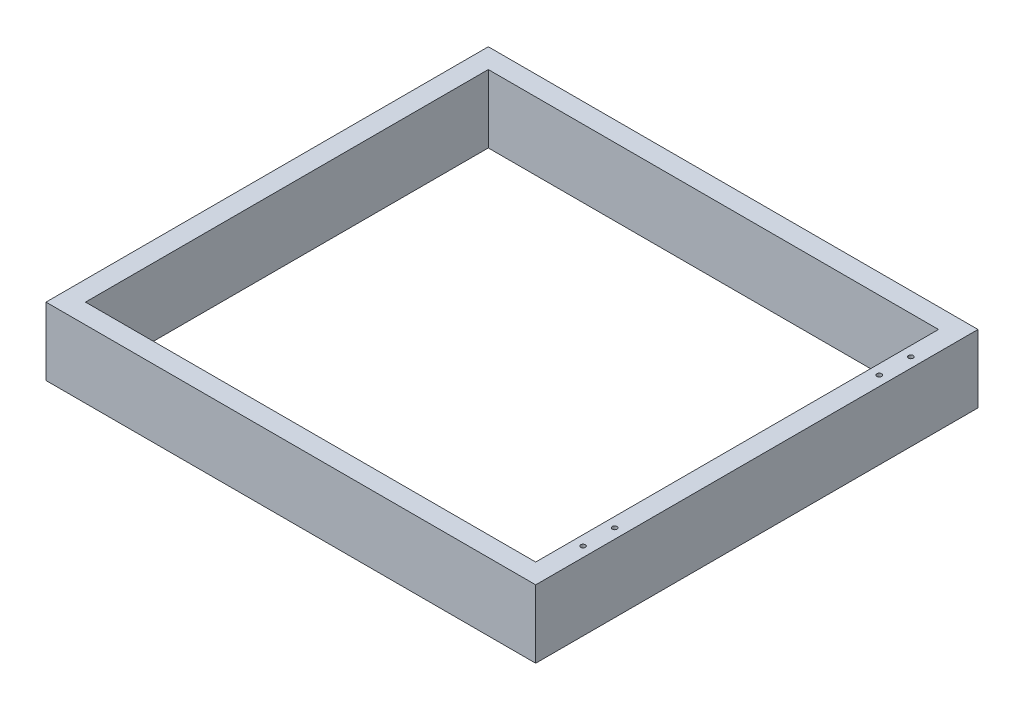
ISO-10303-21;
HEADER;
FILE_DESCRIPTION(('STEP AP214'),'2;1');
FILE_NAME('part.step','',(''),(''),'','','');
FILE_SCHEMA(('AUTOMOTIVE_DESIGN { 1 0 10303 214 1 1 1 1 }'));
ENDSEC;
DATA;
#1=APPLICATION_CONTEXT('core data for automotive mechanical design processes');
#2=APPLICATION_PROTOCOL_DEFINITION('international standard','automotive_design',2000,#1);
#3=PRODUCT_CONTEXT('',#1,'mechanical');
#4=PRODUCT('Part','Part','',(#3));
#5=PRODUCT_RELATED_PRODUCT_CATEGORY('part','',(#4));
#6=PRODUCT_DEFINITION_FORMATION('','',#4);
#7=PRODUCT_DEFINITION_CONTEXT('part definition',#1,'design');
#8=PRODUCT_DEFINITION('design','',#6,#7);
#9=PRODUCT_DEFINITION_SHAPE('','',#8);
#10=(LENGTH_UNIT() NAMED_UNIT(*) SI_UNIT(.MILLI.,.METRE.));
#11=(NAMED_UNIT(*) PLANE_ANGLE_UNIT() SI_UNIT($,.RADIAN.));
#12=(NAMED_UNIT(*) SI_UNIT($,.STERADIAN.) SOLID_ANGLE_UNIT());
#13=UNCERTAINTY_MEASURE_WITH_UNIT(LENGTH_MEASURE(1.E-05),#10,'distance_accuracy_value','');
#14=(GEOMETRIC_REPRESENTATION_CONTEXT(3) GLOBAL_UNCERTAINTY_ASSIGNED_CONTEXT((#13)) GLOBAL_UNIT_ASSIGNED_CONTEXT((#10,
#11,#12)) REPRESENTATION_CONTEXT('',''));
#15=CARTESIAN_POINT('',(0.,0.,0.));
#16=DIRECTION('',(0.,0.,1.));
#17=DIRECTION('',(1.,0.,0.));
#18=AXIS2_PLACEMENT_3D('',#15,#16,#17);
#19=CARTESIAN_POINT('',(0.,43.,0.));
#20=DIRECTION('',(0.,-1.,0.));
#21=DIRECTION('',(0.,0.,-1.));
#22=AXIS2_PLACEMENT_3D('',#19,#20,#21);
#23=PLANE('',#22);
#24=CARTESIAN_POINT('',(303.75,43.,-243.75));
#25=DIRECTION('',(0.,1.,0.));
#26=DIRECTION('',(0.,0.,1.));
#27=AXIS2_PLACEMENT_3D('',#24,#25,#26);
#28=CIRCLE('',#27,1.50000000000002);
#29=CARTESIAN_POINT('',(303.75,43.,-242.25));
#30=VERTEX_POINT('',#29);
#31=EDGE_CURVE('E256',#30,#30,#28,.T.);
#32=ORIENTED_EDGE('',*,*,#31,.F.);
#33=EDGE_LOOP('',(#32));
#34=FACE_BOUND('',#33,.T.);
#35=CARTESIAN_POINT('',(303.75,43.,-223.75));
#36=DIRECTION('',(0.,1.,0.));
#37=DIRECTION('',(0.,0.,1.));
#38=AXIS2_PLACEMENT_3D('',#35,#36,#37);
#39=CIRCLE('',#38,1.50000000000002);
#40=CARTESIAN_POINT('',(303.75,43.,-222.25));
#41=VERTEX_POINT('',#40);
#42=EDGE_CURVE('E264',#41,#41,#39,.T.);
#43=ORIENTED_EDGE('',*,*,#42,.F.);
#44=EDGE_LOOP('',(#43));
#45=FACE_BOUND('',#44,.T.);
#46=CARTESIAN_POINT('',(303.75,43.,-56.25));
#47=DIRECTION('',(0.,1.,0.));
#48=DIRECTION('',(0.,0.,1.));
#49=AXIS2_PLACEMENT_3D('',#46,#47,#48);
#50=CIRCLE('',#49,1.50000000000002);
#51=CARTESIAN_POINT('',(303.75,43.,-54.75));
#52=VERTEX_POINT('',#51);
#53=EDGE_CURVE('E270',#52,#52,#50,.T.);
#54=ORIENTED_EDGE('',*,*,#53,.F.);
#55=EDGE_LOOP('',(#54));
#56=FACE_BOUND('',#55,.T.);
#57=CARTESIAN_POINT('',(303.75,43.,-36.25));
#58=DIRECTION('',(0.,1.,0.));
#59=DIRECTION('',(0.,0.,1.));
#60=AXIS2_PLACEMENT_3D('',#57,#58,#59);
#61=CIRCLE('',#60,1.50000000000002);
#62=CARTESIAN_POINT('',(303.75,43.,-34.75));
#63=VERTEX_POINT('',#62);
#64=EDGE_CURVE('E275',#63,#63,#61,.T.);
#65=ORIENTED_EDGE('',*,*,#64,.F.);
#66=EDGE_LOOP('',(#65));
#67=FACE_BOUND('',#66,.T.);
#68=DIRECTION('',(0.,0.,1.));
#69=VECTOR('',#68,1.);
#70=CARTESIAN_POINT('',(0.,43.,0.));
#71=LINE('',#70,#69);
#72=CARTESIAN_POINT('',(0.,43.,-280.));
#73=VERTEX_POINT('',#72);
#74=CARTESIAN_POINT('',(0.,43.,0.));
#75=VERTEX_POINT('',#74);
#76=EDGE_CURVE('E142',#73,#75,#71,.T.);
#77=ORIENTED_EDGE('',*,*,#76,.T.);
#78=DIRECTION('',(1.,0.,0.));
#79=VECTOR('',#78,1.);
#80=CARTESIAN_POINT('',(0.,43.,0.));
#81=LINE('',#80,#79);
#82=CARTESIAN_POINT('',(310.,43.,0.));
#83=VERTEX_POINT('',#82);
#84=EDGE_CURVE('E145',#75,#83,#81,.T.);
#85=ORIENTED_EDGE('',*,*,#84,.T.);
#86=DIRECTION('',(0.,0.,-1.));
#87=VECTOR('',#86,1.);
#88=CARTESIAN_POINT('',(310.,43.,0.));
#89=LINE('',#88,#87);
#90=CARTESIAN_POINT('',(310.,43.,-280.));
#91=VERTEX_POINT('',#90);
#92=EDGE_CURVE('E148',#83,#91,#89,.T.);
#93=ORIENTED_EDGE('',*,*,#92,.T.);
#94=DIRECTION('',(-1.,0.,0.));
#95=VECTOR('',#94,1.);
#96=CARTESIAN_POINT('',(0.,43.,-280.));
#97=LINE('',#96,#95);
#98=EDGE_CURVE('E150',#91,#73,#97,.T.);
#99=ORIENTED_EDGE('',*,*,#98,.T.);
#100=EDGE_LOOP('',(#77,#85,#93,#99));
#101=FACE_BOUND('',#100,.T.);
#102=DIRECTION('',(0.,0.,1.));
#103=VECTOR('',#102,1.);
#104=CARTESIAN_POINT('',(12.5,43.,-12.5));
#105=LINE('',#104,#103);
#106=CARTESIAN_POINT('',(12.5,43.,-267.5));
#107=VERTEX_POINT('',#106);
#108=CARTESIAN_POINT('',(12.5,43.,-12.5));
#109=VERTEX_POINT('',#108);
#110=EDGE_CURVE('E104',#107,#109,#105,.T.);
#111=ORIENTED_EDGE('',*,*,#110,.F.);
#112=DIRECTION('',(-1.,0.,0.));
#113=VECTOR('',#112,1.);
#114=CARTESIAN_POINT('',(12.5,43.,-267.5));
#115=LINE('',#114,#113);
#116=CARTESIAN_POINT('',(297.5,43.,-267.5));
#117=VERTEX_POINT('',#116);
#118=EDGE_CURVE('E126',#117,#107,#115,.T.);
#119=ORIENTED_EDGE('',*,*,#118,.F.);
#120=DIRECTION('',(0.,0.,-1.));
#121=VECTOR('',#120,1.);
#122=CARTESIAN_POINT('',(297.5,43.,-12.5));
#123=LINE('',#122,#121);
#124=CARTESIAN_POINT('',(297.5,43.,-12.5));
#125=VERTEX_POINT('',#124);
#126=EDGE_CURVE('E124',#125,#117,#123,.T.);
#127=ORIENTED_EDGE('',*,*,#126,.F.);
#128=DIRECTION('',(1.,0.,0.));
#129=VECTOR('',#128,1.);
#130=CARTESIAN_POINT('',(12.5,43.,-12.5));
#131=LINE('',#130,#129);
#132=EDGE_CURVE('E112',#109,#125,#131,.T.);
#133=ORIENTED_EDGE('',*,*,#132,.F.);
#134=EDGE_LOOP('',(#111,#119,#127,#133));
#135=FACE_BOUND('',#134,.T.);
#136=ADVANCED_FACE('F39',(#34,#45,#56,#67,#101,#135),#23,.F.);
#137=CARTESIAN_POINT('',(0.,0.,0.));
#138=DIRECTION('',(0.,-1.,0.));
#139=DIRECTION('',(0.,0.,-1.));
#140=AXIS2_PLACEMENT_3D('',#137,#138,#139);
#141=PLANE('',#140);
#142=DIRECTION('',(0.,0.,1.));
#143=VECTOR('',#142,1.);
#144=CARTESIAN_POINT('',(0.,0.,0.));
#145=LINE('',#144,#143);
#146=CARTESIAN_POINT('',(0.,0.,-280.));
#147=VERTEX_POINT('',#146);
#148=CARTESIAN_POINT('',(0.,0.,0.));
#149=VERTEX_POINT('',#148);
#150=EDGE_CURVE('E120',#147,#149,#145,.T.);
#151=ORIENTED_EDGE('',*,*,#150,.F.);
#152=DIRECTION('',(-1.,0.,0.));
#153=VECTOR('',#152,1.);
#154=CARTESIAN_POINT('',(0.,0.,-280.));
#155=LINE('',#154,#153);
#156=CARTESIAN_POINT('',(310.,0.,-280.));
#157=VERTEX_POINT('',#156);
#158=EDGE_CURVE('E146',#157,#147,#155,.T.);
#159=ORIENTED_EDGE('',*,*,#158,.F.);
#160=DIRECTION('',(0.,0.,-1.));
#161=VECTOR('',#160,1.);
#162=CARTESIAN_POINT('',(310.,0.,0.));
#163=LINE('',#162,#161);
#164=CARTESIAN_POINT('',(310.,0.,0.));
#165=VERTEX_POINT('',#164);
#166=EDGE_CURVE('E157',#165,#157,#163,.T.);
#167=ORIENTED_EDGE('',*,*,#166,.F.);
#168=DIRECTION('',(1.,0.,0.));
#169=VECTOR('',#168,1.);
#170=CARTESIAN_POINT('',(0.,0.,0.));
#171=LINE('',#170,#169);
#172=EDGE_CURVE('E155',#149,#165,#171,.T.);
#173=ORIENTED_EDGE('',*,*,#172,.F.);
#174=EDGE_LOOP('',(#151,#159,#167,#173));
#175=FACE_BOUND('',#174,.T.);
#176=DIRECTION('',(-1.,0.,0.));
#177=VECTOR('',#176,1.);
#178=CARTESIAN_POINT('',(12.5,0.,-267.5));
#179=LINE('',#178,#177);
#180=CARTESIAN_POINT('',(297.5,0.,-267.5));
#181=VERTEX_POINT('',#180);
#182=CARTESIAN_POINT('',(12.5,0.,-267.5));
#183=VERTEX_POINT('',#182);
#184=EDGE_CURVE('E113',#181,#183,#179,.T.);
#185=ORIENTED_EDGE('',*,*,#184,.T.);
#186=DIRECTION('',(0.,0.,1.));
#187=VECTOR('',#186,1.);
#188=CARTESIAN_POINT('',(12.5,0.,-12.5));
#189=LINE('',#188,#187);
#190=CARTESIAN_POINT('',(12.5,0.,-12.5));
#191=VERTEX_POINT('',#190);
#192=EDGE_CURVE('E62',#183,#191,#189,.T.);
#193=ORIENTED_EDGE('',*,*,#192,.T.);
#194=DIRECTION('',(1.,0.,0.));
#195=VECTOR('',#194,1.);
#196=CARTESIAN_POINT('',(12.5,0.,-12.5));
#197=LINE('',#196,#195);
#198=CARTESIAN_POINT('',(297.5,0.,-12.5));
#199=VERTEX_POINT('',#198);
#200=EDGE_CURVE('E119',#191,#199,#197,.T.);
#201=ORIENTED_EDGE('',*,*,#200,.T.);
#202=DIRECTION('',(0.,0.,-1.));
#203=VECTOR('',#202,1.);
#204=CARTESIAN_POINT('',(297.5,0.,-12.5));
#205=LINE('',#204,#203);
#206=EDGE_CURVE('E134',#199,#181,#205,.T.);
#207=ORIENTED_EDGE('',*,*,#206,.T.);
#208=EDGE_LOOP('',(#185,#193,#201,#207));
#209=FACE_BOUND('',#208,.T.);
#210=ADVANCED_FACE('F175',(#175,#209),#141,.T.);
#211=CARTESIAN_POINT('',(0.,43.,0.));
#212=DIRECTION('',(1.,0.,0.));
#213=DIRECTION('',(0.,0.,-1.));
#214=AXIS2_PLACEMENT_3D('',#211,#212,#213);
#215=PLANE('',#214);
#216=ORIENTED_EDGE('',*,*,#150,.T.);
#217=DIRECTION('',(0.,-1.,0.));
#218=VECTOR('',#217,1.);
#219=CARTESIAN_POINT('',(0.,43.,0.));
#220=LINE('',#219,#218);
#221=EDGE_CURVE('E11',#75,#149,#220,.T.);
#222=ORIENTED_EDGE('',*,*,#221,.F.);
#223=ORIENTED_EDGE('',*,*,#76,.F.);
#224=DIRECTION('',(0.,-1.,0.));
#225=VECTOR('',#224,1.);
#226=CARTESIAN_POINT('',(0.,43.,-280.));
#227=LINE('',#226,#225);
#228=EDGE_CURVE('E152',#73,#147,#227,.T.);
#229=ORIENTED_EDGE('',*,*,#228,.T.);
#230=EDGE_LOOP('',(#216,#222,#223,#229));
#231=FACE_BOUND('',#230,.T.);
#232=ADVANCED_FACE('F41',(#231),#215,.F.);
#233=CARTESIAN_POINT('',(0.,43.,0.));
#234=DIRECTION('',(0.,0.,-1.));
#235=DIRECTION('',(-1.,0.,0.));
#236=AXIS2_PLACEMENT_3D('',#233,#234,#235);
#237=PLANE('',#236);
#238=ORIENTED_EDGE('',*,*,#172,.T.);
#239=DIRECTION('',(0.,-1.,0.));
#240=VECTOR('',#239,1.);
#241=CARTESIAN_POINT('',(310.,43.,0.));
#242=LINE('',#241,#240);
#243=EDGE_CURVE('E47',#83,#165,#242,.T.);
#244=ORIENTED_EDGE('',*,*,#243,.F.);
#245=ORIENTED_EDGE('',*,*,#84,.F.);
#246=ORIENTED_EDGE('',*,*,#221,.T.);
#247=EDGE_LOOP('',(#238,#244,#245,#246));
#248=FACE_BOUND('',#247,.T.);
#249=ADVANCED_FACE('F185',(#248),#237,.F.);
#250=CARTESIAN_POINT('',(310.,43.,0.));
#251=DIRECTION('',(-1.,0.,0.));
#252=DIRECTION('',(0.,0.,1.));
#253=AXIS2_PLACEMENT_3D('',#250,#251,#252);
#254=PLANE('',#253);
#255=ORIENTED_EDGE('',*,*,#166,.T.);
#256=DIRECTION('',(0.,-1.,0.));
#257=VECTOR('',#256,1.);
#258=CARTESIAN_POINT('',(310.,43.,-280.));
#259=LINE('',#258,#257);
#260=EDGE_CURVE('E162',#91,#157,#259,.T.);
#261=ORIENTED_EDGE('',*,*,#260,.F.);
#262=ORIENTED_EDGE('',*,*,#92,.F.);
#263=ORIENTED_EDGE('',*,*,#243,.T.);
#264=EDGE_LOOP('',(#255,#261,#262,#263));
#265=FACE_BOUND('',#264,.T.);
#266=ADVANCED_FACE('F169',(#265),#254,.F.);
#267=CARTESIAN_POINT('',(0.,43.,-280.));
#268=DIRECTION('',(0.,0.,1.));
#269=DIRECTION('',(1.,0.,0.));
#270=AXIS2_PLACEMENT_3D('',#267,#268,#269);
#271=PLANE('',#270);
#272=ORIENTED_EDGE('',*,*,#158,.T.);
#273=ORIENTED_EDGE('',*,*,#228,.F.);
#274=ORIENTED_EDGE('',*,*,#98,.F.);
#275=ORIENTED_EDGE('',*,*,#260,.T.);
#276=EDGE_LOOP('',(#272,#273,#274,#275));
#277=FACE_BOUND('',#276,.T.);
#278=ADVANCED_FACE('F179',(#277),#271,.F.);
#279=CARTESIAN_POINT('',(12.5,43.,-12.5));
#280=DIRECTION('',(1.,0.,0.));
#281=DIRECTION('',(0.,0.,-1.));
#282=AXIS2_PLACEMENT_3D('',#279,#280,#281);
#283=PLANE('',#282);
#284=ORIENTED_EDGE('',*,*,#192,.F.);
#285=DIRECTION('',(0.,-1.,0.));
#286=VECTOR('',#285,1.);
#287=CARTESIAN_POINT('',(12.5,43.,-267.5));
#288=LINE('',#287,#286);
#289=EDGE_CURVE('E108',#107,#183,#288,.T.);
#290=ORIENTED_EDGE('',*,*,#289,.F.);
#291=ORIENTED_EDGE('',*,*,#110,.T.);
#292=DIRECTION('',(0.,-1.,0.));
#293=VECTOR('',#292,1.);
#294=CARTESIAN_POINT('',(12.5,43.,-12.5));
#295=LINE('',#294,#293);
#296=EDGE_CURVE('E107',#109,#191,#295,.T.);
#297=ORIENTED_EDGE('',*,*,#296,.T.);
#298=EDGE_LOOP('',(#284,#290,#291,#297));
#299=FACE_BOUND('',#298,.T.);
#300=ADVANCED_FACE('F106',(#299),#283,.T.);
#301=CARTESIAN_POINT('',(12.5,43.,-12.5));
#302=DIRECTION('',(0.,0.,-1.));
#303=DIRECTION('',(-1.,0.,0.));
#304=AXIS2_PLACEMENT_3D('',#301,#302,#303);
#305=PLANE('',#304);
#306=ORIENTED_EDGE('',*,*,#200,.F.);
#307=ORIENTED_EDGE('',*,*,#296,.F.);
#308=ORIENTED_EDGE('',*,*,#132,.T.);
#309=DIRECTION('',(0.,-1.,0.));
#310=VECTOR('',#309,1.);
#311=CARTESIAN_POINT('',(297.5,43.,-12.5));
#312=LINE('',#311,#310);
#313=EDGE_CURVE('E121',#125,#199,#312,.T.);
#314=ORIENTED_EDGE('',*,*,#313,.T.);
#315=EDGE_LOOP('',(#306,#307,#308,#314));
#316=FACE_BOUND('',#315,.T.);
#317=ADVANCED_FACE('F116',(#316),#305,.T.);
#318=CARTESIAN_POINT('',(297.5,43.,-12.5));
#319=DIRECTION('',(-1.,0.,0.));
#320=DIRECTION('',(0.,0.,1.));
#321=AXIS2_PLACEMENT_3D('',#318,#319,#320);
#322=PLANE('',#321);
#323=ORIENTED_EDGE('',*,*,#206,.F.);
#324=ORIENTED_EDGE('',*,*,#313,.F.);
#325=ORIENTED_EDGE('',*,*,#126,.T.);
#326=DIRECTION('',(0.,-1.,0.));
#327=VECTOR('',#326,1.);
#328=CARTESIAN_POINT('',(297.5,43.,-267.5));
#329=LINE('',#328,#327);
#330=EDGE_CURVE('E54',#117,#181,#329,.T.);
#331=ORIENTED_EDGE('',*,*,#330,.T.);
#332=EDGE_LOOP('',(#323,#324,#325,#331));
#333=FACE_BOUND('',#332,.T.);
#334=ADVANCED_FACE('F211',(#333),#322,.T.);
#335=CARTESIAN_POINT('',(12.5,43.,-267.5));
#336=DIRECTION('',(0.,0.,1.));
#337=DIRECTION('',(1.,0.,0.));
#338=AXIS2_PLACEMENT_3D('',#335,#336,#337);
#339=PLANE('',#338);
#340=ORIENTED_EDGE('',*,*,#184,.F.);
#341=ORIENTED_EDGE('',*,*,#330,.F.);
#342=ORIENTED_EDGE('',*,*,#118,.T.);
#343=ORIENTED_EDGE('',*,*,#289,.T.);
#344=EDGE_LOOP('',(#340,#341,#342,#343));
#345=FACE_BOUND('',#344,.T.);
#346=ADVANCED_FACE('F215',(#345),#339,.T.);
#347=CARTESIAN_POINT('',(303.75,33.,-36.25));
#348=DIRECTION('',(0.,1.,0.));
#349=DIRECTION('',(0.,0.,1.));
#350=AXIS2_PLACEMENT_3D('',#347,#348,#349);
#351=CYLINDRICAL_SURFACE('',#350,1.50000000000002);
#352=CARTESIAN_POINT('',(303.75,33.,-36.25));
#353=DIRECTION('',(0.,1.,0.));
#354=DIRECTION('',(0.,0.,1.));
#355=AXIS2_PLACEMENT_3D('',#352,#353,#354);
#356=CIRCLE('',#355,1.50000000000002);
#357=CARTESIAN_POINT('',(303.75,33.,-34.75));
#358=VERTEX_POINT('',#357);
#359=EDGE_CURVE('E273',#358,#358,#356,.T.);
#360=ORIENTED_EDGE('',*,*,#359,.F.);
#361=EDGE_LOOP('',(#360));
#362=FACE_BOUND('',#361,.T.);
#363=ORIENTED_EDGE('',*,*,#64,.T.);
#364=EDGE_LOOP('',(#363));
#365=FACE_BOUND('',#364,.T.);
#366=ADVANCED_FACE('F221',(#362,#365),#351,.F.);
#367=CARTESIAN_POINT('',(303.75,33.,-36.25));
#368=DIRECTION('',(0.,1.,0.));
#369=DIRECTION('',(0.,0.,1.));
#370=AXIS2_PLACEMENT_3D('',#367,#368,#369);
#371=PLANE('',#370);
#372=ORIENTED_EDGE('',*,*,#359,.T.);
#373=EDGE_LOOP('',(#372));
#374=FACE_BOUND('',#373,.T.);
#375=ADVANCED_FACE('F224',(#374),#371,.T.);
#376=CARTESIAN_POINT('',(303.75,33.,-56.25));
#377=DIRECTION('',(0.,1.,0.));
#378=DIRECTION('',(0.,0.,1.));
#379=AXIS2_PLACEMENT_3D('',#376,#377,#378);
#380=CYLINDRICAL_SURFACE('',#379,1.50000000000002);
#381=CARTESIAN_POINT('',(303.75,33.,-56.25));
#382=DIRECTION('',(0.,1.,0.));
#383=DIRECTION('',(0.,0.,1.));
#384=AXIS2_PLACEMENT_3D('',#381,#382,#383);
#385=CIRCLE('',#384,1.50000000000002);
#386=CARTESIAN_POINT('',(303.75,33.,-54.75));
#387=VERTEX_POINT('',#386);
#388=EDGE_CURVE('E267',#387,#387,#385,.T.);
#389=ORIENTED_EDGE('',*,*,#388,.F.);
#390=EDGE_LOOP('',(#389));
#391=FACE_BOUND('',#390,.T.);
#392=ORIENTED_EDGE('',*,*,#53,.T.);
#393=EDGE_LOOP('',(#392));
#394=FACE_BOUND('',#393,.T.);
#395=ADVANCED_FACE('F228',(#391,#394),#380,.F.);
#396=CARTESIAN_POINT('',(303.75,33.,-56.25));
#397=DIRECTION('',(0.,1.,0.));
#398=DIRECTION('',(0.,0.,1.));
#399=AXIS2_PLACEMENT_3D('',#396,#397,#398);
#400=PLANE('',#399);
#401=ORIENTED_EDGE('',*,*,#388,.T.);
#402=EDGE_LOOP('',(#401));
#403=FACE_BOUND('',#402,.T.);
#404=ADVANCED_FACE('F232',(#403),#400,.T.);
#405=CARTESIAN_POINT('',(303.75,33.,-223.75));
#406=DIRECTION('',(0.,1.,0.));
#407=DIRECTION('',(0.,0.,1.));
#408=AXIS2_PLACEMENT_3D('',#405,#406,#407);
#409=CYLINDRICAL_SURFACE('',#408,1.50000000000002);
#410=CARTESIAN_POINT('',(303.75,33.,-223.75));
#411=DIRECTION('',(0.,1.,0.));
#412=DIRECTION('',(0.,0.,1.));
#413=AXIS2_PLACEMENT_3D('',#410,#411,#412);
#414=CIRCLE('',#413,1.50000000000002);
#415=CARTESIAN_POINT('',(303.75,33.,-222.25));
#416=VERTEX_POINT('',#415);
#417=EDGE_CURVE('E259',#416,#416,#414,.T.);
#418=ORIENTED_EDGE('',*,*,#417,.F.);
#419=EDGE_LOOP('',(#418));
#420=FACE_BOUND('',#419,.T.);
#421=ORIENTED_EDGE('',*,*,#42,.T.);
#422=EDGE_LOOP('',(#421));
#423=FACE_BOUND('',#422,.T.);
#424=ADVANCED_FACE('F236',(#420,#423),#409,.F.);
#425=CARTESIAN_POINT('',(303.75,33.,-223.75));
#426=DIRECTION('',(0.,1.,0.));
#427=DIRECTION('',(0.,0.,1.));
#428=AXIS2_PLACEMENT_3D('',#425,#426,#427);
#429=PLANE('',#428);
#430=ORIENTED_EDGE('',*,*,#417,.T.);
#431=EDGE_LOOP('',(#430));
#432=FACE_BOUND('',#431,.T.);
#433=ADVANCED_FACE('F240',(#432),#429,.T.);
#434=CARTESIAN_POINT('',(303.75,33.,-243.75));
#435=DIRECTION('',(0.,1.,0.));
#436=DIRECTION('',(0.,0.,1.));
#437=AXIS2_PLACEMENT_3D('',#434,#435,#436);
#438=CYLINDRICAL_SURFACE('',#437,1.50000000000002);
#439=CARTESIAN_POINT('',(303.75,33.,-243.75));
#440=DIRECTION('',(0.,1.,0.));
#441=DIRECTION('',(0.,0.,1.));
#442=AXIS2_PLACEMENT_3D('',#439,#440,#441);
#443=CIRCLE('',#442,1.50000000000002);
#444=CARTESIAN_POINT('',(303.75,33.,-242.25));
#445=VERTEX_POINT('',#444);
#446=EDGE_CURVE('E132',#445,#445,#443,.T.);
#447=ORIENTED_EDGE('',*,*,#446,.F.);
#448=EDGE_LOOP('',(#447));
#449=FACE_BOUND('',#448,.T.);
#450=ORIENTED_EDGE('',*,*,#31,.T.);
#451=EDGE_LOOP('',(#450));
#452=FACE_BOUND('',#451,.T.);
#453=ADVANCED_FACE('F244',(#449,#452),#438,.F.);
#454=CARTESIAN_POINT('',(303.75,33.,-243.75));
#455=DIRECTION('',(0.,1.,0.));
#456=DIRECTION('',(0.,0.,1.));
#457=AXIS2_PLACEMENT_3D('',#454,#455,#456);
#458=PLANE('',#457);
#459=ORIENTED_EDGE('',*,*,#446,.T.);
#460=EDGE_LOOP('',(#459));
#461=FACE_BOUND('',#460,.T.);
#462=ADVANCED_FACE('F248',(#461),#458,.T.);
#463=CLOSED_SHELL('',(#136,#210,#232,#249,#266,#278,#300,#317,#334,#346,#366,#375,#395,#404,
#424,#433,#453,#462));
#464=MANIFOLD_SOLID_BREP('B2',#463);
#465=ADVANCED_BREP_SHAPE_REPRESENTATION('',(#18,#464),#14);
#466=SHAPE_DEFINITION_REPRESENTATION(#9,#465);
ENDSEC;
END-ISO-10303-21;
